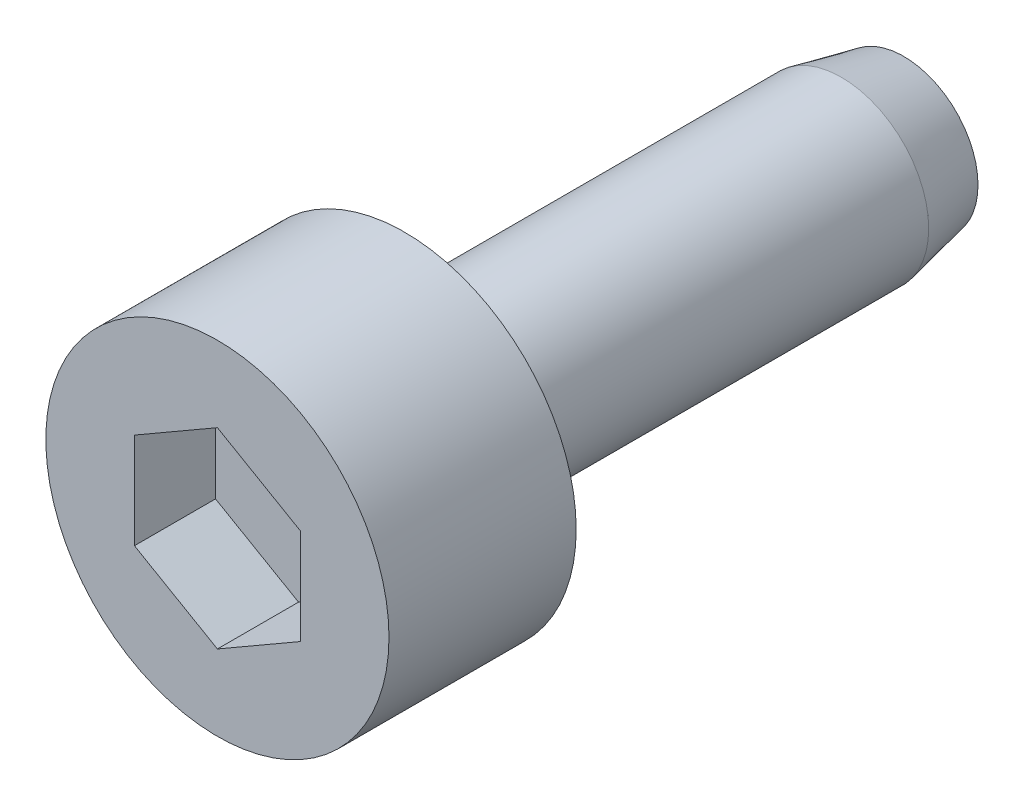
ISO-10303-21;
HEADER;
FILE_DESCRIPTION(('STEP AP214'),'2;1');
FILE_NAME('part.step','',(''),(''),'','','');
FILE_SCHEMA(('AUTOMOTIVE_DESIGN { 1 0 10303 214 1 1 1 1 }'));
ENDSEC;
DATA;
#1=APPLICATION_CONTEXT('core data for automotive mechanical design processes');
#2=APPLICATION_PROTOCOL_DEFINITION('international standard','automotive_design',2000,#1);
#3=PRODUCT_CONTEXT('',#1,'mechanical');
#4=PRODUCT('Part','Part','',(#3));
#5=PRODUCT_RELATED_PRODUCT_CATEGORY('part','',(#4));
#6=PRODUCT_DEFINITION_FORMATION('','',#4);
#7=PRODUCT_DEFINITION_CONTEXT('part definition',#1,'design');
#8=PRODUCT_DEFINITION('design','',#6,#7);
#9=PRODUCT_DEFINITION_SHAPE('','',#8);
#10=(LENGTH_UNIT() NAMED_UNIT(*) SI_UNIT(.MILLI.,.METRE.));
#11=(NAMED_UNIT(*) PLANE_ANGLE_UNIT() SI_UNIT($,.RADIAN.));
#12=(NAMED_UNIT(*) SI_UNIT($,.STERADIAN.) SOLID_ANGLE_UNIT());
#13=UNCERTAINTY_MEASURE_WITH_UNIT(LENGTH_MEASURE(1.E-05),#10,'distance_accuracy_value','');
#14=(GEOMETRIC_REPRESENTATION_CONTEXT(3) GLOBAL_UNCERTAINTY_ASSIGNED_CONTEXT((#13)) GLOBAL_UNIT_ASSIGNED_CONTEXT((#10,
#11,#12)) REPRESENTATION_CONTEXT('',''));
#15=CARTESIAN_POINT('',(0.,0.,0.));
#16=DIRECTION('',(0.,0.,1.));
#17=DIRECTION('',(1.,0.,0.));
#18=AXIS2_PLACEMENT_3D('',#15,#16,#17);
#19=CARTESIAN_POINT('',(0.,0.,-11.));
#20=DIRECTION('',(0.,0.,1.));
#21=DIRECTION('',(1.,0.,0.));
#22=AXIS2_PLACEMENT_3D('',#19,#20,#21);
#23=PLANE('',#22);
#24=CARTESIAN_POINT('',(0.,0.,-11.));
#25=DIRECTION('',(0.,0.,1.));
#26=DIRECTION('',(1.,0.,0.));
#27=AXIS2_PLACEMENT_3D('',#24,#25,#26);
#28=CIRCLE('',#27,1.19);
#29=CARTESIAN_POINT('',(1.19,0.,-11.));
#30=VERTEX_POINT('',#29);
#31=EDGE_CURVE('E10',#30,#30,#28,.T.);
#32=ORIENTED_EDGE('',*,*,#31,.F.);
#33=EDGE_LOOP('',(#32));
#34=FACE_BOUND('',#33,.T.);
#35=ADVANCED_FACE('F16',(#34),#23,.F.);
#36=CARTESIAN_POINT('',(0.,0.,-10.));
#37=DIRECTION('',(0.,0.,1.));
#38=DIRECTION('',(1.,0.,0.));
#39=AXIS2_PLACEMENT_3D('',#36,#37,#38);
#40=CONICAL_SURFACE('',#39,1.4,0.20699219422);
#41=DIRECTION('',(-0.205517234286012,0.,-0.978653496602055));
#42=VECTOR('',#41,1.);
#43=CARTESIAN_POINT('',(1.4,0.,-10.));
#44=LINE('',#43,#42);
#45=CARTESIAN_POINT('',(1.4,0.,-10.));
#46=VERTEX_POINT('',#45);
#47=EDGE_CURVE('E24',#46,#30,#44,.T.);
#48=ORIENTED_EDGE('',*,*,#47,.T.);
#49=ORIENTED_EDGE('',*,*,#31,.T.);
#50=ORIENTED_EDGE('',*,*,#47,.F.);
#51=CARTESIAN_POINT('',(0.,0.,-10.));
#52=DIRECTION('',(0.,0.,1.));
#53=DIRECTION('',(1.,0.,0.));
#54=AXIS2_PLACEMENT_3D('',#51,#52,#53);
#55=CIRCLE('',#54,1.4);
#56=EDGE_CURVE('E169',#46,#46,#55,.T.);
#57=ORIENTED_EDGE('',*,*,#56,.F.);
#58=EDGE_LOOP('',(#48,#49,#50,#57));
#59=FACE_BOUND('',#58,.T.);
#60=ADVANCED_FACE('F201',(#59),#40,.T.);
#61=CARTESIAN_POINT('',(0.,0.,-1.3));
#62=DIRECTION('',(0.,0.,1.));
#63=DIRECTION('',(1.,0.,0.));
#64=AXIS2_PLACEMENT_3D('',#61,#62,#63);
#65=PLANE('',#64);
#66=DIRECTION('',(-0.866025403784329,0.50000000000019,0.));
#67=VECTOR('',#66,1.);
#68=CARTESIAN_POINT('',(1.33,0.767875858022,-1.3));
#69=LINE('',#68,#67);
#70=CARTESIAN_POINT('',(1.33,0.767875858022,-1.3));
#71=VERTEX_POINT('',#70);
#72=CARTESIAN_POINT('',(0.,1.535751716044,-1.3));
#73=VERTEX_POINT('',#72);
#74=EDGE_CURVE('E121',#71,#73,#69,.T.);
#75=ORIENTED_EDGE('',*,*,#74,.T.);
#76=DIRECTION('',(-0.866025403784329,-0.50000000000019,0.));
#77=VECTOR('',#76,1.);
#78=CARTESIAN_POINT('',(0.,1.535751716044,-1.3));
#79=LINE('',#78,#77);
#80=CARTESIAN_POINT('',(-1.33,0.767875858022,-1.3));
#81=VERTEX_POINT('',#80);
#82=EDGE_CURVE('E174',#73,#81,#79,.T.);
#83=ORIENTED_EDGE('',*,*,#82,.T.);
#84=DIRECTION('',(0.,-1.,0.));
#85=VECTOR('',#84,1.);
#86=CARTESIAN_POINT('',(-1.33,0.767875858022,-1.3));
#87=LINE('',#86,#85);
#88=CARTESIAN_POINT('',(-1.33,-0.767875858022,-1.3));
#89=VERTEX_POINT('',#88);
#90=EDGE_CURVE('E158',#81,#89,#87,.T.);
#91=ORIENTED_EDGE('',*,*,#90,.T.);
#92=DIRECTION('',(0.866025403784329,-0.50000000000019,0.));
#93=VECTOR('',#92,1.);
#94=CARTESIAN_POINT('',(-1.33,-0.767875858022,-1.3));
#95=LINE('',#94,#93);
#96=CARTESIAN_POINT('',(0.,-1.535751716044,-1.3));
#97=VERTEX_POINT('',#96);
#98=EDGE_CURVE('E157',#89,#97,#95,.T.);
#99=ORIENTED_EDGE('',*,*,#98,.T.);
#100=DIRECTION('',(0.866025403784329,0.50000000000019,0.));
#101=VECTOR('',#100,1.);
#102=CARTESIAN_POINT('',(0.,-1.535751716044,-1.3));
#103=LINE('',#102,#101);
#104=CARTESIAN_POINT('',(1.33,-0.767875858022,-1.3));
#105=VERTEX_POINT('',#104);
#106=EDGE_CURVE('E192',#97,#105,#103,.T.);
#107=ORIENTED_EDGE('',*,*,#106,.T.);
#108=DIRECTION('',(0.,1.,0.));
#109=VECTOR('',#108,1.);
#110=CARTESIAN_POINT('',(1.33,-0.767875858022,-1.3));
#111=LINE('',#110,#109);
#112=EDGE_CURVE('E170',#105,#71,#111,.T.);
#113=ORIENTED_EDGE('',*,*,#112,.T.);
#114=EDGE_LOOP('',(#75,#83,#91,#99,#107,#113));
#115=FACE_BOUND('',#114,.T.);
#116=ADVANCED_FACE('F231',(#115),#65,.T.);
#117=CARTESIAN_POINT('',(0.,0.,-11.));
#118=DIRECTION('',(0.,0.,1.));
#119=DIRECTION('',(1.,0.,0.));
#120=AXIS2_PLACEMENT_3D('',#117,#118,#119);
#121=CYLINDRICAL_SURFACE('',#120,1.4);
#122=DIRECTION('',(0.,0.,1.));
#123=VECTOR('',#122,1.);
#124=CARTESIAN_POINT('',(1.4,0.,-11.));
#125=LINE('',#124,#123);
#126=CARTESIAN_POINT('',(1.4,0.,-3.));
#127=VERTEX_POINT('',#126);
#128=EDGE_CURVE('E166',#46,#127,#125,.T.);
#129=ORIENTED_EDGE('',*,*,#128,.T.);
#130=CARTESIAN_POINT('',(0.,0.,-3.));
#131=DIRECTION('',(0.,0.,1.));
#132=DIRECTION('',(1.,0.,0.));
#133=AXIS2_PLACEMENT_3D('',#130,#131,#132);
#134=CIRCLE('',#133,1.4);
#135=EDGE_CURVE('E122',#127,#127,#134,.T.);
#136=ORIENTED_EDGE('',*,*,#135,.F.);
#137=ORIENTED_EDGE('',*,*,#128,.F.);
#138=ORIENTED_EDGE('',*,*,#56,.T.);
#139=EDGE_LOOP('',(#129,#136,#137,#138));
#140=FACE_BOUND('',#139,.T.);
#141=ADVANCED_FACE('F205',(#140),#121,.T.);
#142=CARTESIAN_POINT('',(1.33,-0.767875858022,0.));
#143=DIRECTION('',(1.,0.,0.));
#144=DIRECTION('',(0.,1.,0.));
#145=AXIS2_PLACEMENT_3D('',#142,#143,#144);
#146=PLANE('',#145);
#147=DIRECTION('',(0.,1.,0.));
#148=VECTOR('',#147,1.);
#149=CARTESIAN_POINT('',(1.33,-0.767875858022,0.));
#150=LINE('',#149,#148);
#151=CARTESIAN_POINT('',(1.33,-0.767875858022,0.));
#152=VERTEX_POINT('',#151);
#153=CARTESIAN_POINT('',(1.33,0.767875858022,0.));
#154=VERTEX_POINT('',#153);
#155=EDGE_CURVE('E134',#152,#154,#150,.T.);
#156=ORIENTED_EDGE('',*,*,#155,.T.);
#157=DIRECTION('',(0.,0.,-1.));
#158=VECTOR('',#157,1.);
#159=CARTESIAN_POINT('',(1.33,0.767875858022,0.));
#160=LINE('',#159,#158);
#161=EDGE_CURVE('E142',#154,#71,#160,.T.);
#162=ORIENTED_EDGE('',*,*,#161,.T.);
#163=ORIENTED_EDGE('',*,*,#112,.F.);
#164=DIRECTION('',(0.,0.,-1.));
#165=VECTOR('',#164,1.);
#166=CARTESIAN_POINT('',(1.33,-0.767875858022,0.));
#167=LINE('',#166,#165);
#168=EDGE_CURVE('E185',#152,#105,#167,.T.);
#169=ORIENTED_EDGE('',*,*,#168,.F.);
#170=EDGE_LOOP('',(#156,#162,#163,#169));
#171=FACE_BOUND('',#170,.T.);
#172=ADVANCED_FACE('F243',(#171),#146,.F.);
#173=CARTESIAN_POINT('',(0.,-1.535751716044,0.));
#174=DIRECTION('',(0.50000000000019,-0.866025403784329,0.));
#175=DIRECTION('',(0.,0.,-1.));
#176=AXIS2_PLACEMENT_3D('',#173,#174,#175);
#177=PLANE('',#176);
#178=DIRECTION('',(0.866025403784329,0.50000000000019,0.));
#179=VECTOR('',#178,1.);
#180=CARTESIAN_POINT('',(0.,-1.535751716044,0.));
#181=LINE('',#180,#179);
#182=CARTESIAN_POINT('',(0.,-1.535751716044,0.));
#183=VERTEX_POINT('',#182);
#184=EDGE_CURVE('E138',#183,#152,#181,.T.);
#185=ORIENTED_EDGE('',*,*,#184,.T.);
#186=ORIENTED_EDGE('',*,*,#168,.T.);
#187=ORIENTED_EDGE('',*,*,#106,.F.);
#188=DIRECTION('',(0.,0.,-1.));
#189=VECTOR('',#188,1.);
#190=CARTESIAN_POINT('',(0.,-1.535751716044,0.));
#191=LINE('',#190,#189);
#192=EDGE_CURVE('E153',#183,#97,#191,.T.);
#193=ORIENTED_EDGE('',*,*,#192,.F.);
#194=EDGE_LOOP('',(#185,#186,#187,#193));
#195=FACE_BOUND('',#194,.T.);
#196=ADVANCED_FACE('F239',(#195),#177,.F.);
#197=CARTESIAN_POINT('',(-1.33,-0.767875858022,0.));
#198=DIRECTION('',(-0.50000000000019,-0.866025403784329,0.));
#199=DIRECTION('',(-0.866025403784329,0.50000000000019,0.));
#200=AXIS2_PLACEMENT_3D('',#197,#198,#199);
#201=PLANE('',#200);
#202=DIRECTION('',(0.866025403784329,-0.50000000000019,0.));
#203=VECTOR('',#202,1.);
#204=CARTESIAN_POINT('',(-1.33,-0.767875858022,0.));
#205=LINE('',#204,#203);
#206=CARTESIAN_POINT('',(-1.33,-0.767875858022,0.));
#207=VERTEX_POINT('',#206);
#208=EDGE_CURVE('E143',#207,#183,#205,.T.);
#209=ORIENTED_EDGE('',*,*,#208,.T.);
#210=ORIENTED_EDGE('',*,*,#192,.T.);
#211=ORIENTED_EDGE('',*,*,#98,.F.);
#212=DIRECTION('',(0.,0.,-1.));
#213=VECTOR('',#212,1.);
#214=CARTESIAN_POINT('',(-1.33,-0.767875858022,0.));
#215=LINE('',#214,#213);
#216=EDGE_CURVE('E178',#207,#89,#215,.T.);
#217=ORIENTED_EDGE('',*,*,#216,.F.);
#218=EDGE_LOOP('',(#209,#210,#211,#217));
#219=FACE_BOUND('',#218,.T.);
#220=ADVANCED_FACE('F242',(#219),#201,.F.);
#221=CARTESIAN_POINT('',(-1.33,0.767875858022,0.));
#222=DIRECTION('',(-1.,0.,0.));
#223=DIRECTION('',(0.,0.,1.));
#224=AXIS2_PLACEMENT_3D('',#221,#222,#223);
#225=PLANE('',#224);
#226=DIRECTION('',(0.,-1.,0.));
#227=VECTOR('',#226,1.);
#228=CARTESIAN_POINT('',(-1.33,0.767875858022,0.));
#229=LINE('',#228,#227);
#230=CARTESIAN_POINT('',(-1.33,0.767875858022,0.));
#231=VERTEX_POINT('',#230);
#232=EDGE_CURVE('E127',#231,#207,#229,.T.);
#233=ORIENTED_EDGE('',*,*,#232,.T.);
#234=ORIENTED_EDGE('',*,*,#216,.T.);
#235=ORIENTED_EDGE('',*,*,#90,.F.);
#236=DIRECTION('',(0.,0.,-1.));
#237=VECTOR('',#236,1.);
#238=CARTESIAN_POINT('',(-1.33,0.767875858022,0.));
#239=LINE('',#238,#237);
#240=EDGE_CURVE('E165',#231,#81,#239,.T.);
#241=ORIENTED_EDGE('',*,*,#240,.F.);
#242=EDGE_LOOP('',(#233,#234,#235,#241));
#243=FACE_BOUND('',#242,.T.);
#244=ADVANCED_FACE('F247',(#243),#225,.F.);
#245=CARTESIAN_POINT('',(0.,1.535751716044,0.));
#246=DIRECTION('',(-0.50000000000019,0.866025403784329,0.));
#247=DIRECTION('',(0.,0.,1.));
#248=AXIS2_PLACEMENT_3D('',#245,#246,#247);
#249=PLANE('',#248);
#250=DIRECTION('',(-0.866025403784329,-0.50000000000019,0.));
#251=VECTOR('',#250,1.);
#252=CARTESIAN_POINT('',(0.,1.535751716044,0.));
#253=LINE('',#252,#251);
#254=CARTESIAN_POINT('',(0.,1.535751716044,0.));
#255=VERTEX_POINT('',#254);
#256=EDGE_CURVE('E123',#255,#231,#253,.T.);
#257=ORIENTED_EDGE('',*,*,#256,.T.);
#258=ORIENTED_EDGE('',*,*,#240,.T.);
#259=ORIENTED_EDGE('',*,*,#82,.F.);
#260=DIRECTION('',(0.,0.,-1.));
#261=VECTOR('',#260,1.);
#262=CARTESIAN_POINT('',(0.,1.535751716044,0.));
#263=LINE('',#262,#261);
#264=EDGE_CURVE('E117',#255,#73,#263,.T.);
#265=ORIENTED_EDGE('',*,*,#264,.F.);
#266=EDGE_LOOP('',(#257,#258,#259,#265));
#267=FACE_BOUND('',#266,.T.);
#268=ADVANCED_FACE('F220',(#267),#249,.F.);
#269=CARTESIAN_POINT('',(1.33,0.767875858022,0.));
#270=DIRECTION('',(0.50000000000019,0.866025403784329,0.));
#271=DIRECTION('',(0.,0.,-1.));
#272=AXIS2_PLACEMENT_3D('',#269,#270,#271);
#273=PLANE('',#272);
#274=DIRECTION('',(-0.866025403784329,0.50000000000019,0.));
#275=VECTOR('',#274,1.);
#276=CARTESIAN_POINT('',(1.33,0.767875858022,0.));
#277=LINE('',#276,#275);
#278=EDGE_CURVE('E130',#154,#255,#277,.T.);
#279=ORIENTED_EDGE('',*,*,#278,.T.);
#280=ORIENTED_EDGE('',*,*,#264,.T.);
#281=ORIENTED_EDGE('',*,*,#74,.F.);
#282=ORIENTED_EDGE('',*,*,#161,.F.);
#283=EDGE_LOOP('',(#279,#280,#281,#282));
#284=FACE_BOUND('',#283,.T.);
#285=ADVANCED_FACE('F210',(#284),#273,.F.);
#286=CARTESIAN_POINT('',(0.,0.,-3.));
#287=DIRECTION('',(0.,0.,1.));
#288=DIRECTION('',(1.,0.,0.));
#289=AXIS2_PLACEMENT_3D('',#286,#287,#288);
#290=PLANE('',#289);
#291=ORIENTED_EDGE('',*,*,#135,.T.);
#292=EDGE_LOOP('',(#291));
#293=FACE_BOUND('',#292,.T.);
#294=CARTESIAN_POINT('',(0.,0.,-3.));
#295=DIRECTION('',(0.,0.,1.));
#296=DIRECTION('',(1.,0.,0.));
#297=AXIS2_PLACEMENT_3D('',#294,#295,#296);
#298=CIRCLE('',#297,2.75);
#299=CARTESIAN_POINT('',(2.75,0.,-3.));
#300=VERTEX_POINT('',#299);
#301=EDGE_CURVE('E108',#300,#300,#298,.T.);
#302=ORIENTED_EDGE('',*,*,#301,.F.);
#303=EDGE_LOOP('',(#302));
#304=FACE_BOUND('',#303,.T.);
#305=ADVANCED_FACE('F207',(#293,#304),#290,.F.);
#306=CARTESIAN_POINT('',(0.,0.,0.));
#307=DIRECTION('',(0.,0.,1.));
#308=DIRECTION('',(1.,0.,0.));
#309=AXIS2_PLACEMENT_3D('',#306,#307,#308);
#310=PLANE('',#309);
#311=ORIENTED_EDGE('',*,*,#278,.F.);
#312=ORIENTED_EDGE('',*,*,#155,.F.);
#313=ORIENTED_EDGE('',*,*,#184,.F.);
#314=ORIENTED_EDGE('',*,*,#208,.F.);
#315=ORIENTED_EDGE('',*,*,#232,.F.);
#316=ORIENTED_EDGE('',*,*,#256,.F.);
#317=EDGE_LOOP('',(#311,#312,#313,#314,#315,#316));
#318=FACE_BOUND('',#317,.T.);
#319=CARTESIAN_POINT('',(0.,0.,0.));
#320=DIRECTION('',(0.,0.,1.));
#321=DIRECTION('',(1.,0.,0.));
#322=AXIS2_PLACEMENT_3D('',#319,#320,#321);
#323=CIRCLE('',#322,2.75);
#324=CARTESIAN_POINT('',(2.75,0.,0.));
#325=VERTEX_POINT('',#324);
#326=EDGE_CURVE('E106',#325,#325,#323,.T.);
#327=ORIENTED_EDGE('',*,*,#326,.T.);
#328=EDGE_LOOP('',(#327));
#329=FACE_BOUND('',#328,.T.);
#330=ADVANCED_FACE('F112',(#318,#329),#310,.T.);
#331=CARTESIAN_POINT('',(0.,0.,-3.));
#332=DIRECTION('',(0.,0.,1.));
#333=DIRECTION('',(1.,0.,0.));
#334=AXIS2_PLACEMENT_3D('',#331,#332,#333);
#335=CYLINDRICAL_SURFACE('',#334,2.75);
#336=ORIENTED_EDGE('',*,*,#326,.F.);
#337=DIRECTION('',(0.,0.,1.));
#338=VECTOR('',#337,1.);
#339=CARTESIAN_POINT('',(2.75,0.,-3.));
#340=LINE('',#339,#338);
#341=EDGE_CURVE('E103',#300,#325,#340,.T.);
#342=ORIENTED_EDGE('',*,*,#341,.F.);
#343=ORIENTED_EDGE('',*,*,#301,.T.);
#344=ORIENTED_EDGE('',*,*,#341,.T.);
#345=EDGE_LOOP('',(#336,#342,#343,#344));
#346=FACE_BOUND('',#345,.T.);
#347=ADVANCED_FACE('F105',(#346),#335,.T.);
#348=CLOSED_SHELL('',(#35,#60,#116,#141,#172,#196,#220,#244,#268,#285,#305,#330,#347));
#349=MANIFOLD_SOLID_BREP('B1',#348);
#350=ADVANCED_BREP_SHAPE_REPRESENTATION('',(#18,#349),#14);
#351=SHAPE_DEFINITION_REPRESENTATION(#9,#350);
ENDSEC;
END-ISO-10303-21;
